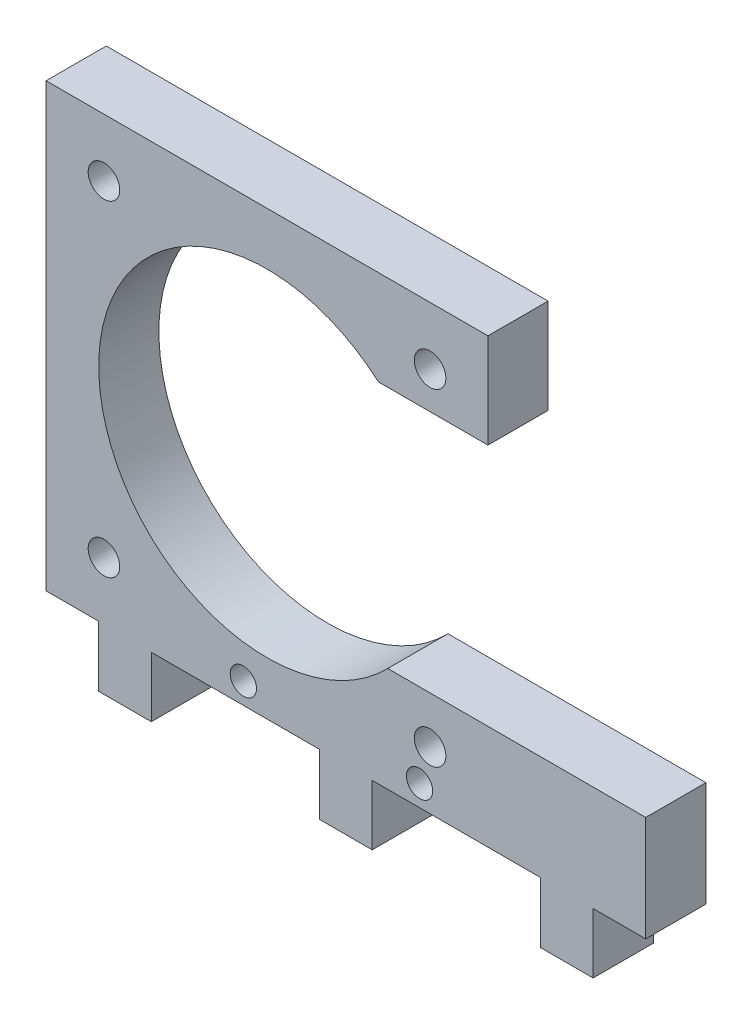
ISO-10303-21;
HEADER;
FILE_DESCRIPTION(('STEP AP214'),'2;1');
FILE_NAME('part.step','',(''),(''),'','','');
FILE_SCHEMA(('AUTOMOTIVE_DESIGN { 1 0 10303 214 1 1 1 1 }'));
ENDSEC;
DATA;
#1=APPLICATION_CONTEXT('core data for automotive mechanical design processes');
#2=APPLICATION_PROTOCOL_DEFINITION('international standard','automotive_design',2000,#1);
#3=PRODUCT_CONTEXT('',#1,'mechanical');
#4=PRODUCT('Part','Part','',(#3));
#5=PRODUCT_RELATED_PRODUCT_CATEGORY('part','',(#4));
#6=PRODUCT_DEFINITION_FORMATION('','',#4);
#7=PRODUCT_DEFINITION_CONTEXT('part definition',#1,'design');
#8=PRODUCT_DEFINITION('design','',#6,#7);
#9=PRODUCT_DEFINITION_SHAPE('','',#8);
#10=(LENGTH_UNIT() NAMED_UNIT(*) SI_UNIT(.MILLI.,.METRE.));
#11=(NAMED_UNIT(*) PLANE_ANGLE_UNIT() SI_UNIT($,.RADIAN.));
#12=(NAMED_UNIT(*) SI_UNIT($,.STERADIAN.) SOLID_ANGLE_UNIT());
#13=UNCERTAINTY_MEASURE_WITH_UNIT(LENGTH_MEASURE(1.E-05),#10,'distance_accuracy_value','');
#14=(GEOMETRIC_REPRESENTATION_CONTEXT(3) GLOBAL_UNCERTAINTY_ASSIGNED_CONTEXT((#13)) GLOBAL_UNIT_ASSIGNED_CONTEXT((#10,
#11,#12)) REPRESENTATION_CONTEXT('',''));
#15=CARTESIAN_POINT('',(0.,0.,0.));
#16=DIRECTION('',(0.,0.,1.));
#17=DIRECTION('',(1.,0.,0.));
#18=AXIS2_PLACEMENT_3D('',#15,#16,#17);
#19=CARTESIAN_POINT('',(-11.62,11.1479389312977,5.72));
#20=DIRECTION('',(0.,0.,1.));
#21=DIRECTION('',(1.,0.,0.));
#22=AXIS2_PLACEMENT_3D('',#19,#20,#21);
#23=PLANE('',#22);
#24=CARTESIAN_POINT('',(-27.12,26.6479389312977,5.72));
#25=DIRECTION('',(0.,0.,1.));
#26=DIRECTION('',(1.,0.,0.));
#27=AXIS2_PLACEMENT_3D('',#24,#25,#26);
#28=CIRCLE('',#27,1.5);
#29=CARTESIAN_POINT('',(-25.62,26.6479389312977,5.72));
#30=VERTEX_POINT('',#29);
#31=EDGE_CURVE('E403',#30,#30,#28,.T.);
#32=ORIENTED_EDGE('',*,*,#31,.F.);
#33=EDGE_LOOP('',(#32));
#34=FACE_BOUND('',#33,.T.);
#35=CARTESIAN_POINT('',(-13.87,-7.90137404580153,5.72));
#36=DIRECTION('',(0.,0.,1.));
#37=DIRECTION('',(1.,0.,0.));
#38=AXIS2_PLACEMENT_3D('',#35,#36,#37);
#39=CIRCLE('',#38,1.25);
#40=CARTESIAN_POINT('',(-12.62,-7.90137404580153,5.72));
#41=VERTEX_POINT('',#40);
#42=EDGE_CURVE('E415',#41,#41,#39,.T.);
#43=ORIENTED_EDGE('',*,*,#42,.F.);
#44=EDGE_LOOP('',(#43));
#45=FACE_BOUND('',#44,.T.);
#46=CARTESIAN_POINT('',(3.87984311123458,-4.45068702290077,5.72));
#47=DIRECTION('',(0.,0.,1.));
#48=DIRECTION('',(1.,0.,0.));
#49=AXIS2_PLACEMENT_3D('',#46,#47,#48);
#50=CIRCLE('',#49,1.5);
#51=CARTESIAN_POINT('',(5.37984311123458,-4.45068702290077,5.72));
#52=VERTEX_POINT('',#51);
#53=EDGE_CURVE('E206',#52,#52,#50,.T.);
#54=ORIENTED_EDGE('',*,*,#53,.F.);
#55=EDGE_LOOP('',(#54));
#56=FACE_BOUND('',#55,.T.);
#57=DIRECTION('',(-1.,0.,0.));
#58=VECTOR('',#57,1.);
#59=CARTESIAN_POINT('',(24.38,0.,5.72));
#60=LINE('',#59,#58);
#61=CARTESIAN_POINT('',(24.38,0.,5.72));
#62=VERTEX_POINT('',#61);
#63=CARTESIAN_POINT('',(-0.142915980787755,0.,5.72));
#64=VERTEX_POINT('',#63);
#65=EDGE_CURVE('E241',#62,#64,#60,.T.);
#66=ORIENTED_EDGE('',*,*,#65,.T.);
#67=CARTESIAN_POINT('',(-11.62,11.1479389312977,5.72));
#68=DIRECTION('',(0.,0.,-1.));
#69=DIRECTION('',(1.,0.,0.));
#70=AXIS2_PLACEMENT_3D('',#67,#68,#69);
#71=CIRCLE('',#70,16.);
#72=CARTESIAN_POINT('',(-1.03699475574164,23.1479389312977,5.72));
#73=VERTEX_POINT('',#72);
#74=EDGE_CURVE('E129',#64,#73,#71,.T.);
#75=ORIENTED_EDGE('',*,*,#74,.T.);
#76=DIRECTION('',(1.,0.,0.));
#77=VECTOR('',#76,1.);
#78=CARTESIAN_POINT('',(9.38,23.1479389312977,5.72));
#79=LINE('',#78,#77);
#80=CARTESIAN_POINT('',(9.38,23.1479389312977,5.72));
#81=VERTEX_POINT('',#80);
#82=EDGE_CURVE('E292',#73,#81,#79,.T.);
#83=ORIENTED_EDGE('',*,*,#82,.T.);
#84=DIRECTION('',(0.,1.,0.));
#85=VECTOR('',#84,1.);
#86=CARTESIAN_POINT('',(9.38,32.1479389312977,5.72));
#87=LINE('',#86,#85);
#88=CARTESIAN_POINT('',(9.38,32.1479389312977,5.72));
#89=VERTEX_POINT('',#88);
#90=EDGE_CURVE('E311',#81,#89,#87,.T.);
#91=ORIENTED_EDGE('',*,*,#90,.T.);
#92=DIRECTION('',(-1.,0.,0.));
#93=VECTOR('',#92,1.);
#94=CARTESIAN_POINT('',(-32.62,32.1479389312977,5.72));
#95=LINE('',#94,#93);
#96=CARTESIAN_POINT('',(-32.62,32.1479389312977,5.72));
#97=VERTEX_POINT('',#96);
#98=EDGE_CURVE('E308',#89,#97,#95,.T.);
#99=ORIENTED_EDGE('',*,*,#98,.T.);
#100=DIRECTION('',(0.,-1.,0.));
#101=VECTOR('',#100,1.);
#102=CARTESIAN_POINT('',(-32.62,-9.85206106870231,5.72));
#103=LINE('',#102,#101);
#104=CARTESIAN_POINT('',(-32.62,-9.85206106870231,5.72));
#105=VERTEX_POINT('',#104);
#106=EDGE_CURVE('E310',#97,#105,#103,.T.);
#107=ORIENTED_EDGE('',*,*,#106,.T.);
#108=DIRECTION('',(1.,0.,0.));
#109=VECTOR('',#108,1.);
#110=CARTESIAN_POINT('',(-27.62,-9.85206106870231,5.72));
#111=LINE('',#110,#109);
#112=CARTESIAN_POINT('',(-27.62,-9.85206106870231,5.72));
#113=VERTEX_POINT('',#112);
#114=EDGE_CURVE('E313',#105,#113,#111,.T.);
#115=ORIENTED_EDGE('',*,*,#114,.T.);
#116=DIRECTION('',(0.,-1.,0.));
#117=VECTOR('',#116,1.);
#118=CARTESIAN_POINT('',(-27.62,-15.6213740458015,5.72));
#119=LINE('',#118,#117);
#120=CARTESIAN_POINT('',(-27.62,-15.6213740458015,5.72));
#121=VERTEX_POINT('',#120);
#122=EDGE_CURVE('E319',#113,#121,#119,.T.);
#123=ORIENTED_EDGE('',*,*,#122,.T.);
#124=DIRECTION('',(1.,0.,0.));
#125=VECTOR('',#124,1.);
#126=CARTESIAN_POINT('',(-22.62,-15.6213740458015,5.72));
#127=LINE('',#126,#125);
#128=CARTESIAN_POINT('',(-22.62,-15.6213740458015,5.72));
#129=VERTEX_POINT('',#128);
#130=EDGE_CURVE('E321',#121,#129,#127,.T.);
#131=ORIENTED_EDGE('',*,*,#130,.T.);
#132=DIRECTION('',(0.,1.,0.));
#133=VECTOR('',#132,1.);
#134=CARTESIAN_POINT('',(-22.62,-9.90137404580153,5.72));
#135=LINE('',#134,#133);
#136=CARTESIAN_POINT('',(-22.62,-9.90137404580153,5.72));
#137=VERTEX_POINT('',#136);
#138=EDGE_CURVE('E323',#129,#137,#135,.T.);
#139=ORIENTED_EDGE('',*,*,#138,.T.);
#140=DIRECTION('',(1.,0.,0.));
#141=VECTOR('',#140,1.);
#142=CARTESIAN_POINT('',(-6.62,-9.90137404580153,5.72));
#143=LINE('',#142,#141);
#144=CARTESIAN_POINT('',(-6.62,-9.90137404580153,5.72));
#145=VERTEX_POINT('',#144);
#146=EDGE_CURVE('E325',#137,#145,#143,.T.);
#147=ORIENTED_EDGE('',*,*,#146,.T.);
#148=DIRECTION('',(0.,-1.,0.));
#149=VECTOR('',#148,1.);
#150=CARTESIAN_POINT('',(-6.62,-15.6706870229008,5.72));
#151=LINE('',#150,#149);
#152=CARTESIAN_POINT('',(-6.62,-15.6706870229008,5.72));
#153=VERTEX_POINT('',#152);
#154=EDGE_CURVE('E327',#145,#153,#151,.T.);
#155=ORIENTED_EDGE('',*,*,#154,.T.);
#156=DIRECTION('',(1.,0.,0.));
#157=VECTOR('',#156,1.);
#158=CARTESIAN_POINT('',(-1.62,-15.6706870229008,5.72));
#159=LINE('',#158,#157);
#160=CARTESIAN_POINT('',(-1.62,-15.6706870229008,5.72));
#161=VERTEX_POINT('',#160);
#162=EDGE_CURVE('E329',#153,#161,#159,.T.);
#163=ORIENTED_EDGE('',*,*,#162,.T.);
#164=DIRECTION('',(0.,1.,0.));
#165=VECTOR('',#164,1.);
#166=CARTESIAN_POINT('',(-1.62,-9.95068702290077,5.72));
#167=LINE('',#166,#165);
#168=CARTESIAN_POINT('',(-1.62,-9.95068702290077,5.72));
#169=VERTEX_POINT('',#168);
#170=EDGE_CURVE('E331',#161,#169,#167,.T.);
#171=ORIENTED_EDGE('',*,*,#170,.T.);
#172=DIRECTION('',(1.,0.,0.));
#173=VECTOR('',#172,1.);
#174=CARTESIAN_POINT('',(14.38,-9.95068702290077,5.72));
#175=LINE('',#174,#173);
#176=CARTESIAN_POINT('',(14.38,-9.95068702290077,5.72));
#177=VERTEX_POINT('',#176);
#178=EDGE_CURVE('E333',#169,#177,#175,.T.);
#179=ORIENTED_EDGE('',*,*,#178,.T.);
#180=DIRECTION('',(0.,-1.,0.));
#181=VECTOR('',#180,1.);
#182=CARTESIAN_POINT('',(14.38,-15.72,5.72));
#183=LINE('',#182,#181);
#184=CARTESIAN_POINT('',(14.38,-15.72,5.72));
#185=VERTEX_POINT('',#184);
#186=EDGE_CURVE('E335',#177,#185,#183,.T.);
#187=ORIENTED_EDGE('',*,*,#186,.T.);
#188=DIRECTION('',(1.,0.,0.));
#189=VECTOR('',#188,1.);
#190=CARTESIAN_POINT('',(19.38,-15.72,5.72));
#191=LINE('',#190,#189);
#192=CARTESIAN_POINT('',(19.38,-15.72,5.72));
#193=VERTEX_POINT('',#192);
#194=EDGE_CURVE('E184',#185,#193,#191,.T.);
#195=ORIENTED_EDGE('',*,*,#194,.T.);
#196=DIRECTION('',(0.,1.,0.));
#197=VECTOR('',#196,1.);
#198=CARTESIAN_POINT('',(19.38,-10.,5.72));
#199=LINE('',#198,#197);
#200=CARTESIAN_POINT('',(19.38,-10.,5.72));
#201=VERTEX_POINT('',#200);
#202=EDGE_CURVE('E178',#193,#201,#199,.T.);
#203=ORIENTED_EDGE('',*,*,#202,.T.);
#204=DIRECTION('',(1.,0.,0.));
#205=VECTOR('',#204,1.);
#206=CARTESIAN_POINT('',(24.38,-10.,5.72));
#207=LINE('',#206,#205);
#208=CARTESIAN_POINT('',(24.38,-10.,5.72));
#209=VERTEX_POINT('',#208);
#210=EDGE_CURVE('E182',#201,#209,#207,.T.);
#211=ORIENTED_EDGE('',*,*,#210,.T.);
#212=DIRECTION('',(0.,1.,0.));
#213=VECTOR('',#212,1.);
#214=CARTESIAN_POINT('',(24.38,0.,5.72));
#215=LINE('',#214,#213);
#216=EDGE_CURVE('E50',#209,#62,#215,.T.);
#217=ORIENTED_EDGE('',*,*,#216,.T.);
#218=EDGE_LOOP('',(#66,#75,#83,#91,#99,#107,#115,#123,#131,#139,#147,#155,#163,#171,#179,#187,
#195,#203,#211,#217));
#219=FACE_BOUND('',#218,.T.);
#220=CARTESIAN_POINT('',(2.88,-7.95068702290077,5.72));
#221=DIRECTION('',(0.,0.,1.));
#222=DIRECTION('',(1.,0.,0.));
#223=AXIS2_PLACEMENT_3D('',#220,#221,#222);
#224=CIRCLE('',#223,1.25);
#225=CARTESIAN_POINT('',(4.13,-7.95068702290077,5.72));
#226=VERTEX_POINT('',#225);
#227=EDGE_CURVE('E421',#226,#226,#224,.T.);
#228=ORIENTED_EDGE('',*,*,#227,.F.);
#229=EDGE_LOOP('',(#228));
#230=FACE_BOUND('',#229,.T.);
#231=CARTESIAN_POINT('',(-27.12,-4.35206106870231,5.72));
#232=DIRECTION('',(0.,0.,1.));
#233=DIRECTION('',(1.,0.,0.));
#234=AXIS2_PLACEMENT_3D('',#231,#232,#233);
#235=CIRCLE('',#234,1.5);
#236=CARTESIAN_POINT('',(-25.62,-4.35206106870231,5.72));
#237=VERTEX_POINT('',#236);
#238=EDGE_CURVE('E409',#237,#237,#235,.T.);
#239=ORIENTED_EDGE('',*,*,#238,.F.);
#240=EDGE_LOOP('',(#239));
#241=FACE_BOUND('',#240,.T.);
#242=CARTESIAN_POINT('',(3.88,26.6479389312977,5.72));
#243=DIRECTION('',(0.,0.,1.));
#244=DIRECTION('',(1.,0.,0.));
#245=AXIS2_PLACEMENT_3D('',#242,#243,#244);
#246=CIRCLE('',#245,1.5);
#247=CARTESIAN_POINT('',(5.38,26.6479389312977,5.72));
#248=VERTEX_POINT('',#247);
#249=EDGE_CURVE('E394',#248,#248,#246,.T.);
#250=ORIENTED_EDGE('',*,*,#249,.F.);
#251=EDGE_LOOP('',(#250));
#252=FACE_BOUND('',#251,.T.);
#253=ADVANCED_FACE('F33',(#34,#45,#56,#219,#230,#241,#252),#23,.T.);
#254=CARTESIAN_POINT('',(-11.62,11.1479389312977,0.));
#255=DIRECTION('',(0.,0.,1.));
#256=DIRECTION('',(1.,0.,0.));
#257=AXIS2_PLACEMENT_3D('',#254,#255,#256);
#258=PLANE('',#257);
#259=DIRECTION('',(-1.,0.,0.));
#260=VECTOR('',#259,1.);
#261=CARTESIAN_POINT('',(24.38,0.,0.));
#262=LINE('',#261,#260);
#263=CARTESIAN_POINT('',(24.38,0.,0.));
#264=VERTEX_POINT('',#263);
#265=CARTESIAN_POINT('',(-0.142915980787755,0.,0.));
#266=VERTEX_POINT('',#265);
#267=EDGE_CURVE('E202',#264,#266,#262,.T.);
#268=ORIENTED_EDGE('',*,*,#267,.F.);
#269=DIRECTION('',(0.,1.,0.));
#270=VECTOR('',#269,1.);
#271=CARTESIAN_POINT('',(24.38,0.,0.));
#272=LINE('',#271,#270);
#273=CARTESIAN_POINT('',(24.38,-10.,0.));
#274=VERTEX_POINT('',#273);
#275=EDGE_CURVE('E121',#274,#264,#272,.T.);
#276=ORIENTED_EDGE('',*,*,#275,.F.);
#277=DIRECTION('',(1.,0.,0.));
#278=VECTOR('',#277,1.);
#279=CARTESIAN_POINT('',(24.38,-10.,0.));
#280=LINE('',#279,#278);
#281=CARTESIAN_POINT('',(19.38,-10.,0.));
#282=VERTEX_POINT('',#281);
#283=EDGE_CURVE('E115',#282,#274,#280,.T.);
#284=ORIENTED_EDGE('',*,*,#283,.F.);
#285=DIRECTION('',(0.,1.,0.));
#286=VECTOR('',#285,1.);
#287=CARTESIAN_POINT('',(19.38,-10.,0.));
#288=LINE('',#287,#286);
#289=CARTESIAN_POINT('',(19.38,-15.72,0.));
#290=VERTEX_POINT('',#289);
#291=EDGE_CURVE('E192',#290,#282,#288,.T.);
#292=ORIENTED_EDGE('',*,*,#291,.F.);
#293=DIRECTION('',(1.,0.,0.));
#294=VECTOR('',#293,1.);
#295=CARTESIAN_POINT('',(19.38,-15.72,0.));
#296=LINE('',#295,#294);
#297=CARTESIAN_POINT('',(14.38,-15.72,0.));
#298=VERTEX_POINT('',#297);
#299=EDGE_CURVE('E236',#298,#290,#296,.T.);
#300=ORIENTED_EDGE('',*,*,#299,.F.);
#301=DIRECTION('',(0.,-1.,0.));
#302=VECTOR('',#301,1.);
#303=CARTESIAN_POINT('',(14.38,-15.72,0.));
#304=LINE('',#303,#302);
#305=CARTESIAN_POINT('',(14.38,-9.95068702290077,0.));
#306=VERTEX_POINT('',#305);
#307=EDGE_CURVE('E234',#306,#298,#304,.T.);
#308=ORIENTED_EDGE('',*,*,#307,.F.);
#309=DIRECTION('',(1.,0.,0.));
#310=VECTOR('',#309,1.);
#311=CARTESIAN_POINT('',(14.38,-9.95068702290077,0.));
#312=LINE('',#311,#310);
#313=CARTESIAN_POINT('',(-1.62,-9.95068702290077,0.));
#314=VERTEX_POINT('',#313);
#315=EDGE_CURVE('E232',#314,#306,#312,.T.);
#316=ORIENTED_EDGE('',*,*,#315,.F.);
#317=DIRECTION('',(0.,1.,0.));
#318=VECTOR('',#317,1.);
#319=CARTESIAN_POINT('',(-1.62,-9.95068702290077,0.));
#320=LINE('',#319,#318);
#321=CARTESIAN_POINT('',(-1.62,-15.6706870229008,0.));
#322=VERTEX_POINT('',#321);
#323=EDGE_CURVE('E230',#322,#314,#320,.T.);
#324=ORIENTED_EDGE('',*,*,#323,.F.);
#325=DIRECTION('',(1.,0.,0.));
#326=VECTOR('',#325,1.);
#327=CARTESIAN_POINT('',(-1.62,-15.6706870229008,0.));
#328=LINE('',#327,#326);
#329=CARTESIAN_POINT('',(-6.62,-15.6706870229008,0.));
#330=VERTEX_POINT('',#329);
#331=EDGE_CURVE('E228',#330,#322,#328,.T.);
#332=ORIENTED_EDGE('',*,*,#331,.F.);
#333=DIRECTION('',(0.,-1.,0.));
#334=VECTOR('',#333,1.);
#335=CARTESIAN_POINT('',(-6.62,-15.6706870229008,0.));
#336=LINE('',#335,#334);
#337=CARTESIAN_POINT('',(-6.62,-9.90137404580153,0.));
#338=VERTEX_POINT('',#337);
#339=EDGE_CURVE('E226',#338,#330,#336,.T.);
#340=ORIENTED_EDGE('',*,*,#339,.F.);
#341=DIRECTION('',(1.,0.,0.));
#342=VECTOR('',#341,1.);
#343=CARTESIAN_POINT('',(-6.62,-9.90137404580153,0.));
#344=LINE('',#343,#342);
#345=CARTESIAN_POINT('',(-22.62,-9.90137404580153,0.));
#346=VERTEX_POINT('',#345);
#347=EDGE_CURVE('E224',#346,#338,#344,.T.);
#348=ORIENTED_EDGE('',*,*,#347,.F.);
#349=DIRECTION('',(0.,1.,0.));
#350=VECTOR('',#349,1.);
#351=CARTESIAN_POINT('',(-22.62,-9.90137404580153,0.));
#352=LINE('',#351,#350);
#353=CARTESIAN_POINT('',(-22.62,-15.6213740458015,0.));
#354=VERTEX_POINT('',#353);
#355=EDGE_CURVE('E222',#354,#346,#352,.T.);
#356=ORIENTED_EDGE('',*,*,#355,.F.);
#357=DIRECTION('',(1.,0.,0.));
#358=VECTOR('',#357,1.);
#359=CARTESIAN_POINT('',(-22.62,-15.6213740458015,0.));
#360=LINE('',#359,#358);
#361=CARTESIAN_POINT('',(-27.62,-15.6213740458015,0.));
#362=VERTEX_POINT('',#361);
#363=EDGE_CURVE('E220',#362,#354,#360,.T.);
#364=ORIENTED_EDGE('',*,*,#363,.F.);
#365=DIRECTION('',(0.,-1.,0.));
#366=VECTOR('',#365,1.);
#367=CARTESIAN_POINT('',(-27.62,-15.6213740458015,0.));
#368=LINE('',#367,#366);
#369=CARTESIAN_POINT('',(-27.62,-9.85206106870231,0.));
#370=VERTEX_POINT('',#369);
#371=EDGE_CURVE('E218',#370,#362,#368,.T.);
#372=ORIENTED_EDGE('',*,*,#371,.F.);
#373=DIRECTION('',(1.,0.,0.));
#374=VECTOR('',#373,1.);
#375=CARTESIAN_POINT('',(-27.62,-9.85206106870231,0.));
#376=LINE('',#375,#374);
#377=CARTESIAN_POINT('',(-32.62,-9.85206106870231,0.));
#378=VERTEX_POINT('',#377);
#379=EDGE_CURVE('E216',#378,#370,#376,.T.);
#380=ORIENTED_EDGE('',*,*,#379,.F.);
#381=DIRECTION('',(0.,-1.,0.));
#382=VECTOR('',#381,1.);
#383=CARTESIAN_POINT('',(-32.62,-9.85206106870231,0.));
#384=LINE('',#383,#382);
#385=CARTESIAN_POINT('',(-32.62,32.1479389312977,0.));
#386=VERTEX_POINT('',#385);
#387=EDGE_CURVE('E214',#386,#378,#384,.T.);
#388=ORIENTED_EDGE('',*,*,#387,.F.);
#389=DIRECTION('',(-1.,0.,0.));
#390=VECTOR('',#389,1.);
#391=CARTESIAN_POINT('',(-32.62,32.1479389312977,0.));
#392=LINE('',#391,#390);
#393=CARTESIAN_POINT('',(9.38,32.1479389312977,0.));
#394=VERTEX_POINT('',#393);
#395=EDGE_CURVE('E212',#394,#386,#392,.T.);
#396=ORIENTED_EDGE('',*,*,#395,.F.);
#397=DIRECTION('',(0.,1.,0.));
#398=VECTOR('',#397,1.);
#399=CARTESIAN_POINT('',(9.38,32.1479389312977,0.));
#400=LINE('',#399,#398);
#401=CARTESIAN_POINT('',(9.38,23.1479389312977,0.));
#402=VERTEX_POINT('',#401);
#403=EDGE_CURVE('E210',#402,#394,#400,.T.);
#404=ORIENTED_EDGE('',*,*,#403,.F.);
#405=DIRECTION('',(1.,0.,0.));
#406=VECTOR('',#405,1.);
#407=CARTESIAN_POINT('',(9.38,23.1479389312977,0.));
#408=LINE('',#407,#406);
#409=CARTESIAN_POINT('',(-1.03699475574164,23.1479389312977,0.));
#410=VERTEX_POINT('',#409);
#411=EDGE_CURVE('E208',#410,#402,#408,.T.);
#412=ORIENTED_EDGE('',*,*,#411,.F.);
#413=CARTESIAN_POINT('',(-11.62,11.1479389312977,0.));
#414=DIRECTION('',(0.,0.,-1.));
#415=DIRECTION('',(1.,0.,0.));
#416=AXIS2_PLACEMENT_3D('',#413,#414,#415);
#417=CIRCLE('',#416,16.);
#418=EDGE_CURVE('E205',#266,#410,#417,.T.);
#419=ORIENTED_EDGE('',*,*,#418,.F.);
#420=EDGE_LOOP('',(#268,#276,#284,#292,#300,#308,#316,#324,#332,#340,#348,#356,#364,#372,#380,
#388,#396,#404,#412,#419));
#421=FACE_BOUND('',#420,.T.);
#422=CARTESIAN_POINT('',(3.87984311123458,-4.45068702290077,0.));
#423=DIRECTION('',(0.,0.,1.));
#424=DIRECTION('',(1.,0.,0.));
#425=AXIS2_PLACEMENT_3D('',#422,#423,#424);
#426=CIRCLE('',#425,1.5);
#427=CARTESIAN_POINT('',(5.37984311123458,-4.45068702290077,0.));
#428=VERTEX_POINT('',#427);
#429=EDGE_CURVE('E424',#428,#428,#426,.T.);
#430=ORIENTED_EDGE('',*,*,#429,.T.);
#431=EDGE_LOOP('',(#430));
#432=FACE_BOUND('',#431,.T.);
#433=CARTESIAN_POINT('',(2.88,-7.95068702290077,0.));
#434=DIRECTION('',(0.,0.,1.));
#435=DIRECTION('',(1.,0.,0.));
#436=AXIS2_PLACEMENT_3D('',#433,#434,#435);
#437=CIRCLE('',#436,1.25);
#438=CARTESIAN_POINT('',(4.13,-7.95068702290077,0.));
#439=VERTEX_POINT('',#438);
#440=EDGE_CURVE('E418',#439,#439,#437,.T.);
#441=ORIENTED_EDGE('',*,*,#440,.T.);
#442=EDGE_LOOP('',(#441));
#443=FACE_BOUND('',#442,.T.);
#444=CARTESIAN_POINT('',(-13.87,-7.90137404580153,0.));
#445=DIRECTION('',(0.,0.,1.));
#446=DIRECTION('',(1.,0.,0.));
#447=AXIS2_PLACEMENT_3D('',#444,#445,#446);
#448=CIRCLE('',#447,1.25);
#449=CARTESIAN_POINT('',(-12.62,-7.90137404580153,0.));
#450=VERTEX_POINT('',#449);
#451=EDGE_CURVE('E412',#450,#450,#448,.T.);
#452=ORIENTED_EDGE('',*,*,#451,.T.);
#453=EDGE_LOOP('',(#452));
#454=FACE_BOUND('',#453,.T.);
#455=CARTESIAN_POINT('',(-27.12,-4.35206106870231,0.));
#456=DIRECTION('',(0.,0.,1.));
#457=DIRECTION('',(1.,0.,0.));
#458=AXIS2_PLACEMENT_3D('',#455,#456,#457);
#459=CIRCLE('',#458,1.5);
#460=CARTESIAN_POINT('',(-25.62,-4.35206106870231,0.));
#461=VERTEX_POINT('',#460);
#462=EDGE_CURVE('E406',#461,#461,#459,.T.);
#463=ORIENTED_EDGE('',*,*,#462,.T.);
#464=EDGE_LOOP('',(#463));
#465=FACE_BOUND('',#464,.T.);
#466=CARTESIAN_POINT('',(-27.12,26.6479389312977,0.));
#467=DIRECTION('',(0.,0.,1.));
#468=DIRECTION('',(1.,0.,0.));
#469=AXIS2_PLACEMENT_3D('',#466,#467,#468);
#470=CIRCLE('',#469,1.5);
#471=CARTESIAN_POINT('',(-25.62,26.6479389312977,0.));
#472=VERTEX_POINT('',#471);
#473=EDGE_CURVE('E400',#472,#472,#470,.T.);
#474=ORIENTED_EDGE('',*,*,#473,.T.);
#475=EDGE_LOOP('',(#474));
#476=FACE_BOUND('',#475,.T.);
#477=CARTESIAN_POINT('',(3.88,26.6479389312977,0.));
#478=DIRECTION('',(0.,0.,1.));
#479=DIRECTION('',(1.,0.,0.));
#480=AXIS2_PLACEMENT_3D('',#477,#478,#479);
#481=CIRCLE('',#480,1.5);
#482=CARTESIAN_POINT('',(5.38,26.6479389312977,0.));
#483=VERTEX_POINT('',#482);
#484=EDGE_CURVE('E397',#483,#483,#481,.T.);
#485=ORIENTED_EDGE('',*,*,#484,.T.);
#486=EDGE_LOOP('',(#485));
#487=FACE_BOUND('',#486,.T.);
#488=ADVANCED_FACE('F296',(#421,#432,#443,#454,#465,#476,#487),#258,.F.);
#489=CARTESIAN_POINT('',(24.38,0.,5.72));
#490=DIRECTION('',(0.,-1.,0.));
#491=DIRECTION('',(0.,0.,-1.));
#492=AXIS2_PLACEMENT_3D('',#489,#490,#491);
#493=PLANE('',#492);
#494=ORIENTED_EDGE('',*,*,#267,.T.);
#495=DIRECTION('',(0.,0.,-1.));
#496=VECTOR('',#495,1.);
#497=CARTESIAN_POINT('',(-0.142915980787755,0.,5.72));
#498=LINE('',#497,#496);
#499=EDGE_CURVE('E11',#64,#266,#498,.T.);
#500=ORIENTED_EDGE('',*,*,#499,.F.);
#501=ORIENTED_EDGE('',*,*,#65,.F.);
#502=DIRECTION('',(0.,0.,-1.));
#503=VECTOR('',#502,1.);
#504=CARTESIAN_POINT('',(24.38,0.,5.72));
#505=LINE('',#504,#503);
#506=EDGE_CURVE('E198',#62,#264,#505,.T.);
#507=ORIENTED_EDGE('',*,*,#506,.T.);
#508=EDGE_LOOP('',(#494,#500,#501,#507));
#509=FACE_BOUND('',#508,.T.);
#510=ADVANCED_FACE('F35',(#509),#493,.F.);
#511=CARTESIAN_POINT('',(-11.62,11.1479389312977,5.72));
#512=DIRECTION('',(0.,0.,-1.));
#513=DIRECTION('',(-1.,0.,0.));
#514=AXIS2_PLACEMENT_3D('',#511,#512,#513);
#515=CYLINDRICAL_SURFACE('',#514,16.);
#516=ORIENTED_EDGE('',*,*,#418,.T.);
#517=DIRECTION('',(0.,0.,-1.));
#518=VECTOR('',#517,1.);
#519=CARTESIAN_POINT('',(-1.03699475574164,23.1479389312977,5.72));
#520=LINE('',#519,#518);
#521=EDGE_CURVE('E42',#73,#410,#520,.T.);
#522=ORIENTED_EDGE('',*,*,#521,.F.);
#523=ORIENTED_EDGE('',*,*,#74,.F.);
#524=ORIENTED_EDGE('',*,*,#499,.T.);
#525=EDGE_LOOP('',(#516,#522,#523,#524));
#526=FACE_BOUND('',#525,.T.);
#527=ADVANCED_FACE('F632',(#526),#515,.F.);
#528=CARTESIAN_POINT('',(9.38,23.1479389312977,5.72));
#529=DIRECTION('',(0.,1.,0.));
#530=DIRECTION('',(0.,0.,1.));
#531=AXIS2_PLACEMENT_3D('',#528,#529,#530);
#532=PLANE('',#531);
#533=ORIENTED_EDGE('',*,*,#411,.T.);
#534=DIRECTION('',(0.,0.,-1.));
#535=VECTOR('',#534,1.);
#536=CARTESIAN_POINT('',(9.38,23.1479389312977,5.72));
#537=LINE('',#536,#535);
#538=EDGE_CURVE('E284',#81,#402,#537,.T.);
#539=ORIENTED_EDGE('',*,*,#538,.F.);
#540=ORIENTED_EDGE('',*,*,#82,.F.);
#541=ORIENTED_EDGE('',*,*,#521,.T.);
#542=EDGE_LOOP('',(#533,#539,#540,#541));
#543=FACE_BOUND('',#542,.T.);
#544=ADVANCED_FACE('F290',(#543),#532,.F.);
#545=CARTESIAN_POINT('',(9.38,32.1479389312977,5.72));
#546=DIRECTION('',(-1.,0.,0.));
#547=DIRECTION('',(0.,-1.,0.));
#548=AXIS2_PLACEMENT_3D('',#545,#546,#547);
#549=PLANE('',#548);
#550=ORIENTED_EDGE('',*,*,#403,.T.);
#551=DIRECTION('',(0.,0.,-1.));
#552=VECTOR('',#551,1.);
#553=CARTESIAN_POINT('',(9.38,32.1479389312977,5.72));
#554=LINE('',#553,#552);
#555=EDGE_CURVE('E281',#89,#394,#554,.T.);
#556=ORIENTED_EDGE('',*,*,#555,.F.);
#557=ORIENTED_EDGE('',*,*,#90,.F.);
#558=ORIENTED_EDGE('',*,*,#538,.T.);
#559=EDGE_LOOP('',(#550,#556,#557,#558));
#560=FACE_BOUND('',#559,.T.);
#561=ADVANCED_FACE('F302',(#560),#549,.F.);
#562=CARTESIAN_POINT('',(-32.62,32.1479389312977,5.72));
#563=DIRECTION('',(0.,-1.,0.));
#564=DIRECTION('',(0.,0.,-1.));
#565=AXIS2_PLACEMENT_3D('',#562,#563,#564);
#566=PLANE('',#565);
#567=ORIENTED_EDGE('',*,*,#395,.T.);
#568=DIRECTION('',(0.,0.,-1.));
#569=VECTOR('',#568,1.);
#570=CARTESIAN_POINT('',(-32.62,32.1479389312977,5.72));
#571=LINE('',#570,#569);
#572=EDGE_CURVE('E278',#97,#386,#571,.T.);
#573=ORIENTED_EDGE('',*,*,#572,.F.);
#574=ORIENTED_EDGE('',*,*,#98,.F.);
#575=ORIENTED_EDGE('',*,*,#555,.T.);
#576=EDGE_LOOP('',(#567,#573,#574,#575));
#577=FACE_BOUND('',#576,.T.);
#578=ADVANCED_FACE('F306',(#577),#566,.F.);
#579=CARTESIAN_POINT('',(-32.62,-9.85206106870231,5.72));
#580=DIRECTION('',(1.,0.,0.));
#581=DIRECTION('',(0.,0.,-1.));
#582=AXIS2_PLACEMENT_3D('',#579,#580,#581);
#583=PLANE('',#582);
#584=ORIENTED_EDGE('',*,*,#387,.T.);
#585=DIRECTION('',(0.,0.,-1.));
#586=VECTOR('',#585,1.);
#587=CARTESIAN_POINT('',(-32.62,-9.85206106870231,5.72));
#588=LINE('',#587,#586);
#589=EDGE_CURVE('E275',#105,#378,#588,.T.);
#590=ORIENTED_EDGE('',*,*,#589,.F.);
#591=ORIENTED_EDGE('',*,*,#106,.F.);
#592=ORIENTED_EDGE('',*,*,#572,.T.);
#593=EDGE_LOOP('',(#584,#590,#591,#592));
#594=FACE_BOUND('',#593,.T.);
#595=ADVANCED_FACE('F597',(#594),#583,.F.);
#596=CARTESIAN_POINT('',(-27.62,-9.85206106870231,5.72));
#597=DIRECTION('',(0.,1.,0.));
#598=DIRECTION('',(-1.,0.,0.));
#599=AXIS2_PLACEMENT_3D('',#596,#597,#598);
#600=PLANE('',#599);
#601=ORIENTED_EDGE('',*,*,#379,.T.);
#602=DIRECTION('',(0.,0.,-1.));
#603=VECTOR('',#602,1.);
#604=CARTESIAN_POINT('',(-27.62,-9.85206106870231,5.72));
#605=LINE('',#604,#603);
#606=EDGE_CURVE('E272',#113,#370,#605,.T.);
#607=ORIENTED_EDGE('',*,*,#606,.F.);
#608=ORIENTED_EDGE('',*,*,#114,.F.);
#609=ORIENTED_EDGE('',*,*,#589,.T.);
#610=EDGE_LOOP('',(#601,#607,#608,#609));
#611=FACE_BOUND('',#610,.T.);
#612=ADVANCED_FACE('F587',(#611),#600,.F.);
#613=CARTESIAN_POINT('',(-27.62,-15.6213740458015,5.72));
#614=DIRECTION('',(1.,0.,0.));
#615=DIRECTION('',(0.,0.,-1.));
#616=AXIS2_PLACEMENT_3D('',#613,#614,#615);
#617=PLANE('',#616);
#618=ORIENTED_EDGE('',*,*,#371,.T.);
#619=DIRECTION('',(0.,0.,-1.));
#620=VECTOR('',#619,1.);
#621=CARTESIAN_POINT('',(-27.62,-15.6213740458015,5.72));
#622=LINE('',#621,#620);
#623=EDGE_CURVE('E269',#121,#362,#622,.T.);
#624=ORIENTED_EDGE('',*,*,#623,.F.);
#625=ORIENTED_EDGE('',*,*,#122,.F.);
#626=ORIENTED_EDGE('',*,*,#606,.T.);
#627=EDGE_LOOP('',(#618,#624,#625,#626));
#628=FACE_BOUND('',#627,.T.);
#629=ADVANCED_FACE('F577',(#628),#617,.F.);
#630=CARTESIAN_POINT('',(-22.62,-15.6213740458015,5.72));
#631=DIRECTION('',(0.,1.,0.));
#632=DIRECTION('',(0.,0.,1.));
#633=AXIS2_PLACEMENT_3D('',#630,#631,#632);
#634=PLANE('',#633);
#635=ORIENTED_EDGE('',*,*,#363,.T.);
#636=DIRECTION('',(0.,0.,-1.));
#637=VECTOR('',#636,1.);
#638=CARTESIAN_POINT('',(-22.62,-15.6213740458015,5.72));
#639=LINE('',#638,#637);
#640=EDGE_CURVE('E266',#129,#354,#639,.T.);
#641=ORIENTED_EDGE('',*,*,#640,.F.);
#642=ORIENTED_EDGE('',*,*,#130,.F.);
#643=ORIENTED_EDGE('',*,*,#623,.T.);
#644=EDGE_LOOP('',(#635,#641,#642,#643));
#645=FACE_BOUND('',#644,.T.);
#646=ADVANCED_FACE('F567',(#645),#634,.F.);
#647=CARTESIAN_POINT('',(-22.62,-9.90137404580153,5.72));
#648=DIRECTION('',(-1.,0.,0.));
#649=DIRECTION('',(0.,0.,1.));
#650=AXIS2_PLACEMENT_3D('',#647,#648,#649);
#651=PLANE('',#650);
#652=ORIENTED_EDGE('',*,*,#355,.T.);
#653=DIRECTION('',(0.,0.,-1.));
#654=VECTOR('',#653,1.);
#655=CARTESIAN_POINT('',(-22.62,-9.90137404580153,5.72));
#656=LINE('',#655,#654);
#657=EDGE_CURVE('E263',#137,#346,#656,.T.);
#658=ORIENTED_EDGE('',*,*,#657,.F.);
#659=ORIENTED_EDGE('',*,*,#138,.F.);
#660=ORIENTED_EDGE('',*,*,#640,.T.);
#661=EDGE_LOOP('',(#652,#658,#659,#660));
#662=FACE_BOUND('',#661,.T.);
#663=ADVANCED_FACE('F557',(#662),#651,.F.);
#664=CARTESIAN_POINT('',(-6.62,-9.90137404580153,5.72));
#665=DIRECTION('',(0.,1.,0.));
#666=DIRECTION('',(0.,0.,1.));
#667=AXIS2_PLACEMENT_3D('',#664,#665,#666);
#668=PLANE('',#667);
#669=ORIENTED_EDGE('',*,*,#347,.T.);
#670=DIRECTION('',(0.,0.,-1.));
#671=VECTOR('',#670,1.);
#672=CARTESIAN_POINT('',(-6.62,-9.90137404580153,5.72));
#673=LINE('',#672,#671);
#674=EDGE_CURVE('E260',#145,#338,#673,.T.);
#675=ORIENTED_EDGE('',*,*,#674,.F.);
#676=ORIENTED_EDGE('',*,*,#146,.F.);
#677=ORIENTED_EDGE('',*,*,#657,.T.);
#678=EDGE_LOOP('',(#669,#675,#676,#677));
#679=FACE_BOUND('',#678,.T.);
#680=ADVANCED_FACE('F547',(#679),#668,.F.);
#681=CARTESIAN_POINT('',(-6.62,-15.6706870229008,5.72));
#682=DIRECTION('',(1.,0.,0.));
#683=DIRECTION('',(0.,0.,-1.));
#684=AXIS2_PLACEMENT_3D('',#681,#682,#683);
#685=PLANE('',#684);
#686=ORIENTED_EDGE('',*,*,#339,.T.);
#687=DIRECTION('',(0.,0.,-1.));
#688=VECTOR('',#687,1.);
#689=CARTESIAN_POINT('',(-6.62,-15.6706870229008,5.72));
#690=LINE('',#689,#688);
#691=EDGE_CURVE('E257',#153,#330,#690,.T.);
#692=ORIENTED_EDGE('',*,*,#691,.F.);
#693=ORIENTED_EDGE('',*,*,#154,.F.);
#694=ORIENTED_EDGE('',*,*,#674,.T.);
#695=EDGE_LOOP('',(#686,#692,#693,#694));
#696=FACE_BOUND('',#695,.T.);
#697=ADVANCED_FACE('F537',(#696),#685,.F.);
#698=CARTESIAN_POINT('',(-1.62,-15.6706870229008,5.72));
#699=DIRECTION('',(0.,1.,0.));
#700=DIRECTION('',(0.,0.,1.));
#701=AXIS2_PLACEMENT_3D('',#698,#699,#700);
#702=PLANE('',#701);
#703=ORIENTED_EDGE('',*,*,#331,.T.);
#704=DIRECTION('',(0.,0.,-1.));
#705=VECTOR('',#704,1.);
#706=CARTESIAN_POINT('',(-1.62,-15.6706870229008,5.72));
#707=LINE('',#706,#705);
#708=EDGE_CURVE('E254',#161,#322,#707,.T.);
#709=ORIENTED_EDGE('',*,*,#708,.F.);
#710=ORIENTED_EDGE('',*,*,#162,.F.);
#711=ORIENTED_EDGE('',*,*,#691,.T.);
#712=EDGE_LOOP('',(#703,#709,#710,#711));
#713=FACE_BOUND('',#712,.T.);
#714=ADVANCED_FACE('F527',(#713),#702,.F.);
#715=CARTESIAN_POINT('',(-1.62,-9.95068702290077,5.72));
#716=DIRECTION('',(-1.,0.,0.));
#717=DIRECTION('',(0.,-1.,0.));
#718=AXIS2_PLACEMENT_3D('',#715,#716,#717);
#719=PLANE('',#718);
#720=ORIENTED_EDGE('',*,*,#323,.T.);
#721=DIRECTION('',(0.,0.,-1.));
#722=VECTOR('',#721,1.);
#723=CARTESIAN_POINT('',(-1.62,-9.95068702290077,5.72));
#724=LINE('',#723,#722);
#725=EDGE_CURVE('E251',#169,#314,#724,.T.);
#726=ORIENTED_EDGE('',*,*,#725,.F.);
#727=ORIENTED_EDGE('',*,*,#170,.F.);
#728=ORIENTED_EDGE('',*,*,#708,.T.);
#729=EDGE_LOOP('',(#720,#726,#727,#728));
#730=FACE_BOUND('',#729,.T.);
#731=ADVANCED_FACE('F517',(#730),#719,.F.);
#732=CARTESIAN_POINT('',(14.38,-9.95068702290077,5.72));
#733=DIRECTION('',(0.,1.,0.));
#734=DIRECTION('',(-1.,0.,0.));
#735=AXIS2_PLACEMENT_3D('',#732,#733,#734);
#736=PLANE('',#735);
#737=ORIENTED_EDGE('',*,*,#315,.T.);
#738=DIRECTION('',(0.,0.,-1.));
#739=VECTOR('',#738,1.);
#740=CARTESIAN_POINT('',(14.38,-9.95068702290077,5.72));
#741=LINE('',#740,#739);
#742=EDGE_CURVE('E248',#177,#306,#741,.T.);
#743=ORIENTED_EDGE('',*,*,#742,.F.);
#744=ORIENTED_EDGE('',*,*,#178,.F.);
#745=ORIENTED_EDGE('',*,*,#725,.T.);
#746=EDGE_LOOP('',(#737,#743,#744,#745));
#747=FACE_BOUND('',#746,.T.);
#748=ADVANCED_FACE('F508',(#747),#736,.F.);
#749=CARTESIAN_POINT('',(14.38,-15.72,5.72));
#750=DIRECTION('',(1.,0.,0.));
#751=DIRECTION('',(0.,0.,-1.));
#752=AXIS2_PLACEMENT_3D('',#749,#750,#751);
#753=PLANE('',#752);
#754=ORIENTED_EDGE('',*,*,#307,.T.);
#755=DIRECTION('',(0.,0.,-1.));
#756=VECTOR('',#755,1.);
#757=CARTESIAN_POINT('',(14.38,-15.72,5.72));
#758=LINE('',#757,#756);
#759=EDGE_CURVE('E245',#185,#298,#758,.T.);
#760=ORIENTED_EDGE('',*,*,#759,.F.);
#761=ORIENTED_EDGE('',*,*,#186,.F.);
#762=ORIENTED_EDGE('',*,*,#742,.T.);
#763=EDGE_LOOP('',(#754,#760,#761,#762));
#764=FACE_BOUND('',#763,.T.);
#765=ADVANCED_FACE('F341',(#764),#753,.F.);
#766=CARTESIAN_POINT('',(19.38,-15.72,5.72));
#767=DIRECTION('',(0.,1.,0.));
#768=DIRECTION('',(0.,0.,1.));
#769=AXIS2_PLACEMENT_3D('',#766,#767,#768);
#770=PLANE('',#769);
#771=ORIENTED_EDGE('',*,*,#299,.T.);
#772=DIRECTION('',(0.,0.,-1.));
#773=VECTOR('',#772,1.);
#774=CARTESIAN_POINT('',(19.38,-15.72,5.72));
#775=LINE('',#774,#773);
#776=EDGE_CURVE('E193',#193,#290,#775,.T.);
#777=ORIENTED_EDGE('',*,*,#776,.F.);
#778=ORIENTED_EDGE('',*,*,#194,.F.);
#779=ORIENTED_EDGE('',*,*,#759,.T.);
#780=EDGE_LOOP('',(#771,#777,#778,#779));
#781=FACE_BOUND('',#780,.T.);
#782=ADVANCED_FACE('F345',(#781),#770,.F.);
#783=CARTESIAN_POINT('',(19.38,-10.,5.72));
#784=DIRECTION('',(-1.,0.,0.));
#785=DIRECTION('',(0.,0.,1.));
#786=AXIS2_PLACEMENT_3D('',#783,#784,#785);
#787=PLANE('',#786);
#788=ORIENTED_EDGE('',*,*,#291,.T.);
#789=DIRECTION('',(0.,0.,-1.));
#790=VECTOR('',#789,1.);
#791=CARTESIAN_POINT('',(19.38,-10.,5.72));
#792=LINE('',#791,#790);
#793=EDGE_CURVE('E189',#201,#282,#792,.T.);
#794=ORIENTED_EDGE('',*,*,#793,.F.);
#795=ORIENTED_EDGE('',*,*,#202,.F.);
#796=ORIENTED_EDGE('',*,*,#776,.T.);
#797=EDGE_LOOP('',(#788,#794,#795,#796));
#798=FACE_BOUND('',#797,.T.);
#799=ADVANCED_FACE('F190',(#798),#787,.F.);
#800=CARTESIAN_POINT('',(24.38,-10.,5.72));
#801=DIRECTION('',(0.,1.,0.));
#802=DIRECTION('',(-1.,0.,0.));
#803=AXIS2_PLACEMENT_3D('',#800,#801,#802);
#804=PLANE('',#803);
#805=ORIENTED_EDGE('',*,*,#283,.T.);
#806=DIRECTION('',(0.,0.,-1.));
#807=VECTOR('',#806,1.);
#808=CARTESIAN_POINT('',(24.38,-10.,5.72));
#809=LINE('',#808,#807);
#810=EDGE_CURVE('E194',#209,#274,#809,.T.);
#811=ORIENTED_EDGE('',*,*,#810,.F.);
#812=ORIENTED_EDGE('',*,*,#210,.F.);
#813=ORIENTED_EDGE('',*,*,#793,.T.);
#814=EDGE_LOOP('',(#805,#811,#812,#813));
#815=FACE_BOUND('',#814,.T.);
#816=ADVANCED_FACE('F196',(#815),#804,.F.);
#817=CARTESIAN_POINT('',(24.38,0.,5.72));
#818=DIRECTION('',(-1.,0.,0.));
#819=DIRECTION('',(0.,0.,1.));
#820=AXIS2_PLACEMENT_3D('',#817,#818,#819);
#821=PLANE('',#820);
#822=ORIENTED_EDGE('',*,*,#275,.T.);
#823=ORIENTED_EDGE('',*,*,#506,.F.);
#824=ORIENTED_EDGE('',*,*,#216,.F.);
#825=ORIENTED_EDGE('',*,*,#810,.T.);
#826=EDGE_LOOP('',(#822,#823,#824,#825));
#827=FACE_BOUND('',#826,.T.);
#828=ADVANCED_FACE('F349',(#827),#821,.F.);
#829=CARTESIAN_POINT('',(3.87984311123458,-4.45068702290077,5.72));
#830=DIRECTION('',(0.,0.,-1.));
#831=DIRECTION('',(-1.,0.,0.));
#832=AXIS2_PLACEMENT_3D('',#829,#830,#831);
#833=CYLINDRICAL_SURFACE('',#832,1.5);
#834=ORIENTED_EDGE('',*,*,#53,.T.);
#835=EDGE_LOOP('',(#834));
#836=FACE_BOUND('',#835,.T.);
#837=ORIENTED_EDGE('',*,*,#429,.F.);
#838=EDGE_LOOP('',(#837));
#839=FACE_BOUND('',#838,.T.);
#840=ADVANCED_FACE('F351',(#836,#839),#833,.F.);
#841=CARTESIAN_POINT('',(2.88,-7.95068702290077,5.72));
#842=DIRECTION('',(0.,0.,-1.));
#843=DIRECTION('',(-1.,0.,0.));
#844=AXIS2_PLACEMENT_3D('',#841,#842,#843);
#845=CYLINDRICAL_SURFACE('',#844,1.25);
#846=ORIENTED_EDGE('',*,*,#227,.T.);
#847=EDGE_LOOP('',(#846));
#848=FACE_BOUND('',#847,.T.);
#849=ORIENTED_EDGE('',*,*,#440,.F.);
#850=EDGE_LOOP('',(#849));
#851=FACE_BOUND('',#850,.T.);
#852=ADVANCED_FACE('F357',(#848,#851),#845,.F.);
#853=CARTESIAN_POINT('',(-13.87,-7.90137404580153,5.72));
#854=DIRECTION('',(0.,0.,-1.));
#855=DIRECTION('',(-1.,0.,0.));
#856=AXIS2_PLACEMENT_3D('',#853,#854,#855);
#857=CYLINDRICAL_SURFACE('',#856,1.25);
#858=ORIENTED_EDGE('',*,*,#42,.T.);
#859=EDGE_LOOP('',(#858));
#860=FACE_BOUND('',#859,.T.);
#861=ORIENTED_EDGE('',*,*,#451,.F.);
#862=EDGE_LOOP('',(#861));
#863=FACE_BOUND('',#862,.T.);
#864=ADVANCED_FACE('F373',(#860,#863),#857,.F.);
#865=CARTESIAN_POINT('',(-27.12,-4.35206106870231,5.72));
#866=DIRECTION('',(0.,0.,-1.));
#867=DIRECTION('',(-1.,0.,0.));
#868=AXIS2_PLACEMENT_3D('',#865,#866,#867);
#869=CYLINDRICAL_SURFACE('',#868,1.5);
#870=ORIENTED_EDGE('',*,*,#238,.T.);
#871=EDGE_LOOP('',(#870));
#872=FACE_BOUND('',#871,.T.);
#873=ORIENTED_EDGE('',*,*,#462,.F.);
#874=EDGE_LOOP('',(#873));
#875=FACE_BOUND('',#874,.T.);
#876=ADVANCED_FACE('F377',(#872,#875),#869,.F.);
#877=CARTESIAN_POINT('',(-27.12,26.6479389312977,5.72));
#878=DIRECTION('',(0.,0.,-1.));
#879=DIRECTION('',(-1.,0.,0.));
#880=AXIS2_PLACEMENT_3D('',#877,#878,#879);
#881=CYLINDRICAL_SURFACE('',#880,1.5);
#882=ORIENTED_EDGE('',*,*,#31,.T.);
#883=EDGE_LOOP('',(#882));
#884=FACE_BOUND('',#883,.T.);
#885=ORIENTED_EDGE('',*,*,#473,.F.);
#886=EDGE_LOOP('',(#885));
#887=FACE_BOUND('',#886,.T.);
#888=ADVANCED_FACE('F381',(#884,#887),#881,.F.);
#889=CARTESIAN_POINT('',(3.88,26.6479389312977,5.72));
#890=DIRECTION('',(0.,0.,-1.));
#891=DIRECTION('',(-1.,0.,0.));
#892=AXIS2_PLACEMENT_3D('',#889,#890,#891);
#893=CYLINDRICAL_SURFACE('',#892,1.5);
#894=ORIENTED_EDGE('',*,*,#249,.T.);
#895=EDGE_LOOP('',(#894));
#896=FACE_BOUND('',#895,.T.);
#897=ORIENTED_EDGE('',*,*,#484,.F.);
#898=EDGE_LOOP('',(#897));
#899=FACE_BOUND('',#898,.T.);
#900=ADVANCED_FACE('F385',(#896,#899),#893,.F.);
#901=CLOSED_SHELL('',(#253,#488,#510,#527,#544,#561,#578,#595,#612,#629,#646,#663,#680,#697,
#714,#731,#748,#765,#782,#799,#816,#828,#840,#852,#864,#876,#888,#900));
#902=MANIFOLD_SOLID_BREP('B2',#901);
#903=ADVANCED_BREP_SHAPE_REPRESENTATION('',(#18,#902),#14);
#904=SHAPE_DEFINITION_REPRESENTATION(#9,#903);
ENDSEC;
END-ISO-10303-21;
